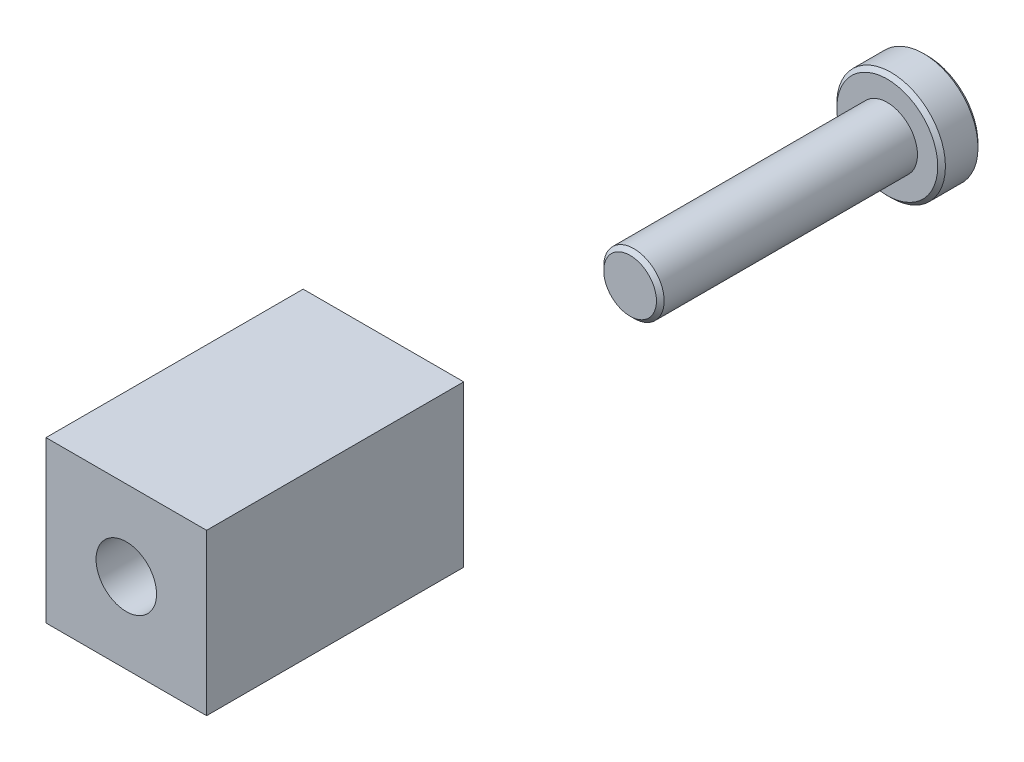
ISO-10303-21;
HEADER;
FILE_DESCRIPTION(('STEP AP214'),'2;1');
FILE_NAME('part.step','',(''),(''),'','','');
FILE_SCHEMA(('AUTOMOTIVE_DESIGN { 1 0 10303 214 1 1 1 1 }'));
ENDSEC;
DATA;
#1=APPLICATION_CONTEXT('core data for automotive mechanical design processes');
#2=APPLICATION_PROTOCOL_DEFINITION('international standard','automotive_design',2000,#1);
#3=PRODUCT_CONTEXT('',#1,'mechanical');
#4=PRODUCT('Part','Part','',(#3));
#5=PRODUCT_RELATED_PRODUCT_CATEGORY('part','',(#4));
#6=PRODUCT_DEFINITION_FORMATION('','',#4);
#7=PRODUCT_DEFINITION_CONTEXT('part definition',#1,'design');
#8=PRODUCT_DEFINITION('design','',#6,#7);
#9=PRODUCT_DEFINITION_SHAPE('','',#8);
#10=(LENGTH_UNIT() NAMED_UNIT(*) SI_UNIT(.MILLI.,.METRE.));
#11=(NAMED_UNIT(*) PLANE_ANGLE_UNIT() SI_UNIT($,.RADIAN.));
#12=(NAMED_UNIT(*) SI_UNIT($,.STERADIAN.) SOLID_ANGLE_UNIT());
#13=UNCERTAINTY_MEASURE_WITH_UNIT(LENGTH_MEASURE(1.E-05),#10,'distance_accuracy_value','');
#14=(GEOMETRIC_REPRESENTATION_CONTEXT(3) GLOBAL_UNCERTAINTY_ASSIGNED_CONTEXT((#13)) GLOBAL_UNIT_ASSIGNED_CONTEXT((#10,
#11,#12)) REPRESENTATION_CONTEXT('',''));
#15=CARTESIAN_POINT('',(0.,0.,0.));
#16=DIRECTION('',(0.,0.,1.));
#17=DIRECTION('',(1.,0.,0.));
#18=AXIS2_PLACEMENT_3D('',#15,#16,#17);
#19=CARTESIAN_POINT('',(-15.8613491960392,15.8613491960392,158.283276511442));
#20=DIRECTION('',(1.,0.,0.));
#21=DIRECTION('',(0.,1.,0.));
#22=AXIS2_PLACEMENT_3D('',#19,#20,#21);
#23=PLANE('',#22);
#24=DIRECTION('',(0.,-1.,0.));
#25=VECTOR('',#24,1.);
#26=CARTESIAN_POINT('',(-15.8613491960392,15.8613491960392,107.483276511442));
#27=LINE('',#26,#25);
#28=CARTESIAN_POINT('',(-15.8613491960392,15.8613491960392,107.483276511442));
#29=VERTEX_POINT('',#28);
#30=CARTESIAN_POINT('',(-15.8613491960392,-15.8613491960392,107.483276511442));
#31=VERTEX_POINT('',#30);
#32=EDGE_CURVE('E108',#29,#31,#27,.T.);
#33=ORIENTED_EDGE('',*,*,#32,.T.);
#34=DIRECTION('',(0.,0.,-1.));
#35=VECTOR('',#34,1.);
#36=CARTESIAN_POINT('',(-15.8613491960392,-15.8613491960392,158.283276511442));
#37=LINE('',#36,#35);
#38=CARTESIAN_POINT('',(-15.8613491960392,-15.8613491960392,158.283276511442));
#39=VERTEX_POINT('',#38);
#40=EDGE_CURVE('E12',#39,#31,#37,.T.);
#41=ORIENTED_EDGE('',*,*,#40,.F.);
#42=DIRECTION('',(0.,-1.,0.));
#43=VECTOR('',#42,1.);
#44=CARTESIAN_POINT('',(-15.8613491960392,15.8613491960392,158.283276511442));
#45=LINE('',#44,#43);
#46=CARTESIAN_POINT('',(-15.8613491960392,15.8613491960392,158.283276511442));
#47=VERTEX_POINT('',#46);
#48=EDGE_CURVE('E96',#47,#39,#45,.T.);
#49=ORIENTED_EDGE('',*,*,#48,.F.);
#50=DIRECTION('',(0.,0.,-1.));
#51=VECTOR('',#50,1.);
#52=CARTESIAN_POINT('',(-15.8613491960392,15.8613491960392,158.283276511442));
#53=LINE('',#52,#51);
#54=EDGE_CURVE('E104',#47,#29,#53,.T.);
#55=ORIENTED_EDGE('',*,*,#54,.T.);
#56=EDGE_LOOP('',(#33,#41,#49,#55));
#57=FACE_BOUND('',#56,.T.);
#58=ADVANCED_FACE('F45',(#57),#23,.F.);
#59=CARTESIAN_POINT('',(-15.8613491960392,-15.8613491960392,158.283276511442));
#60=DIRECTION('',(0.,1.,0.));
#61=DIRECTION('',(0.,0.,1.));
#62=AXIS2_PLACEMENT_3D('',#59,#60,#61);
#63=PLANE('',#62);
#64=DIRECTION('',(1.,0.,0.));
#65=VECTOR('',#64,1.);
#66=CARTESIAN_POINT('',(-15.8613491960392,-15.8613491960392,107.483276511442));
#67=LINE('',#66,#65);
#68=CARTESIAN_POINT('',(15.8613491960392,-15.8613491960392,107.483276511442));
#69=VERTEX_POINT('',#68);
#70=EDGE_CURVE('E100',#31,#69,#67,.T.);
#71=ORIENTED_EDGE('',*,*,#70,.T.);
#72=DIRECTION('',(0.,0.,-1.));
#73=VECTOR('',#72,1.);
#74=CARTESIAN_POINT('',(15.8613491960392,-15.8613491960392,158.283276511442));
#75=LINE('',#74,#73);
#76=CARTESIAN_POINT('',(15.8613491960392,-15.8613491960392,158.283276511442));
#77=VERTEX_POINT('',#76);
#78=EDGE_CURVE('E53',#77,#69,#75,.T.);
#79=ORIENTED_EDGE('',*,*,#78,.F.);
#80=DIRECTION('',(1.,0.,0.));
#81=VECTOR('',#80,1.);
#82=CARTESIAN_POINT('',(-15.8613491960392,-15.8613491960392,158.283276511442));
#83=LINE('',#82,#81);
#84=EDGE_CURVE('E91',#39,#77,#83,.T.);
#85=ORIENTED_EDGE('',*,*,#84,.F.);
#86=ORIENTED_EDGE('',*,*,#40,.T.);
#87=EDGE_LOOP('',(#71,#79,#85,#86));
#88=FACE_BOUND('',#87,.T.);
#89=ADVANCED_FACE('F99',(#88),#63,.F.);
#90=CARTESIAN_POINT('',(15.8613491960392,15.8613491960392,158.283276511442));
#91=DIRECTION('',(-1.,0.,0.));
#92=DIRECTION('',(0.,-1.,0.));
#93=AXIS2_PLACEMENT_3D('',#90,#91,#92);
#94=PLANE('',#93);
#95=DIRECTION('',(0.,1.,0.));
#96=VECTOR('',#95,1.);
#97=CARTESIAN_POINT('',(15.8613491960392,15.8613491960392,107.483276511442));
#98=LINE('',#97,#96);
#99=CARTESIAN_POINT('',(15.8613491960392,15.8613491960392,107.483276511442));
#100=VERTEX_POINT('',#99);
#101=EDGE_CURVE('E78',#69,#100,#98,.T.);
#102=ORIENTED_EDGE('',*,*,#101,.T.);
#103=DIRECTION('',(0.,0.,-1.));
#104=VECTOR('',#103,1.);
#105=CARTESIAN_POINT('',(15.8613491960392,15.8613491960392,158.283276511442));
#106=LINE('',#105,#104);
#107=CARTESIAN_POINT('',(15.8613491960392,15.8613491960392,158.283276511442));
#108=VERTEX_POINT('',#107);
#109=EDGE_CURVE('E101',#108,#100,#106,.T.);
#110=ORIENTED_EDGE('',*,*,#109,.F.);
#111=DIRECTION('',(0.,1.,0.));
#112=VECTOR('',#111,1.);
#113=CARTESIAN_POINT('',(15.8613491960392,15.8613491960392,158.283276511442));
#114=LINE('',#113,#112);
#115=EDGE_CURVE('E94',#77,#108,#114,.T.);
#116=ORIENTED_EDGE('',*,*,#115,.F.);
#117=ORIENTED_EDGE('',*,*,#78,.T.);
#118=EDGE_LOOP('',(#102,#110,#116,#117));
#119=FACE_BOUND('',#118,.T.);
#120=ADVANCED_FACE('F102',(#119),#94,.F.);
#121=CARTESIAN_POINT('',(-15.8613491960392,15.8613491960392,158.283276511442));
#122=DIRECTION('',(0.,-1.,0.));
#123=DIRECTION('',(0.,0.,-1.));
#124=AXIS2_PLACEMENT_3D('',#121,#122,#123);
#125=PLANE('',#124);
#126=DIRECTION('',(-1.,0.,0.));
#127=VECTOR('',#126,1.);
#128=CARTESIAN_POINT('',(-15.8613491960392,15.8613491960392,107.483276511442));
#129=LINE('',#128,#127);
#130=EDGE_CURVE('E84',#100,#29,#129,.T.);
#131=ORIENTED_EDGE('',*,*,#130,.T.);
#132=ORIENTED_EDGE('',*,*,#54,.F.);
#133=DIRECTION('',(-1.,0.,0.));
#134=VECTOR('',#133,1.);
#135=CARTESIAN_POINT('',(-15.8613491960392,15.8613491960392,158.283276511442));
#136=LINE('',#135,#134);
#137=EDGE_CURVE('E61',#108,#47,#136,.T.);
#138=ORIENTED_EDGE('',*,*,#137,.F.);
#139=ORIENTED_EDGE('',*,*,#109,.T.);
#140=EDGE_LOOP('',(#131,#132,#138,#139));
#141=FACE_BOUND('',#140,.T.);
#142=ADVANCED_FACE('F116',(#141),#125,.F.);
#143=CARTESIAN_POINT('',(0.,0.,158.283276511442));
#144=DIRECTION('',(0.,0.,1.));
#145=DIRECTION('',(1.,0.,0.));
#146=AXIS2_PLACEMENT_3D('',#143,#144,#145);
#147=PLANE('',#146);
#148=CARTESIAN_POINT('',(0.,0.,158.283276511442));
#149=DIRECTION('',(0.,0.,-1.));
#150=DIRECTION('',(-1.,0.,0.));
#151=AXIS2_PLACEMENT_3D('',#148,#149,#150);
#152=CIRCLE('',#151,5.97535);
#153=CARTESIAN_POINT('',(-5.97535,0.,158.283276511442));
#154=VERTEX_POINT('',#153);
#155=EDGE_CURVE('E111',#154,#154,#152,.T.);
#156=ORIENTED_EDGE('',*,*,#155,.T.);
#157=EDGE_LOOP('',(#156));
#158=FACE_BOUND('',#157,.T.);
#159=ORIENTED_EDGE('',*,*,#48,.T.);
#160=ORIENTED_EDGE('',*,*,#84,.T.);
#161=ORIENTED_EDGE('',*,*,#115,.T.);
#162=ORIENTED_EDGE('',*,*,#137,.T.);
#163=EDGE_LOOP('',(#159,#160,#161,#162));
#164=FACE_BOUND('',#163,.T.);
#165=ADVANCED_FACE('F92',(#158,#164),#147,.T.);
#166=CARTESIAN_POINT('',(0.,0.,107.483276511442));
#167=DIRECTION('',(0.,0.,1.));
#168=DIRECTION('',(1.,0.,0.));
#169=AXIS2_PLACEMENT_3D('',#166,#167,#168);
#170=PLANE('',#169);
#171=CARTESIAN_POINT('',(0.,0.,107.483276511442));
#172=DIRECTION('',(0.,0.,-1.));
#173=DIRECTION('',(-1.,0.,0.));
#174=AXIS2_PLACEMENT_3D('',#171,#172,#173);
#175=CIRCLE('',#174,5.97535);
#176=CARTESIAN_POINT('',(-5.97535,0.,107.483276511442));
#177=VERTEX_POINT('',#176);
#178=EDGE_CURVE('E122',#177,#177,#175,.T.);
#179=ORIENTED_EDGE('',*,*,#178,.F.);
#180=EDGE_LOOP('',(#179));
#181=FACE_BOUND('',#180,.T.);
#182=ORIENTED_EDGE('',*,*,#32,.F.);
#183=ORIENTED_EDGE('',*,*,#130,.F.);
#184=ORIENTED_EDGE('',*,*,#101,.F.);
#185=ORIENTED_EDGE('',*,*,#70,.F.);
#186=EDGE_LOOP('',(#182,#183,#184,#185));
#187=FACE_BOUND('',#186,.T.);
#188=ADVANCED_FACE('F119',(#181,#187),#170,.F.);
#189=CARTESIAN_POINT('',(0.,0.,158.283276511442));
#190=DIRECTION('',(0.,0.,-1.));
#191=DIRECTION('',(-1.,0.,0.));
#192=AXIS2_PLACEMENT_3D('',#189,#190,#191);
#193=CYLINDRICAL_SURFACE('',#192,5.97535);
#194=ORIENTED_EDGE('',*,*,#155,.F.);
#195=EDGE_LOOP('',(#194));
#196=FACE_BOUND('',#195,.T.);
#197=ORIENTED_EDGE('',*,*,#178,.T.);
#198=EDGE_LOOP('',(#197));
#199=FACE_BOUND('',#198,.T.);
#200=ADVANCED_FACE('F129',(#196,#199),#193,.F.);
#201=CLOSED_SHELL('',(#58,#89,#120,#142,#165,#188,#200));
#202=MANIFOLD_SOLID_BREP('B2',#201);
#203=CARTESIAN_POINT('',(0.,0.,7.95866666666667));
#204=DIRECTION('',(0.,0.,1.));
#205=DIRECTION('',(1.,0.,0.));
#206=AXIS2_PLACEMENT_3D('',#203,#204,#205);
#207=PLANE('',#206);
#208=CARTESIAN_POINT('',(0.,0.,7.95866666666667));
#209=DIRECTION('',(0.,0.,1.));
#210=DIRECTION('',(1.,0.,0.));
#211=AXIS2_PLACEMENT_3D('',#208,#209,#210);
#212=CIRCLE('',#211,9.96950000000001);
#213=CARTESIAN_POINT('',(9.96950000000001,0.,7.95866666666667));
#214=VERTEX_POINT('',#213);
#215=EDGE_CURVE('E201',#214,#214,#212,.T.);
#216=ORIENTED_EDGE('',*,*,#215,.T.);
#217=EDGE_LOOP('',(#216));
#218=FACE_BOUND('',#217,.T.);
#219=CARTESIAN_POINT('',(0.,0.,7.95866666666667));
#220=DIRECTION('',(0.,0.,1.));
#221=DIRECTION('',(1.,0.,0.));
#222=AXIS2_PLACEMENT_3D('',#219,#220,#221);
#223=CIRCLE('',#222,5.969);
#224=CARTESIAN_POINT('',(5.969,0.,7.95866666666667));
#225=VERTEX_POINT('',#224);
#226=EDGE_CURVE('E216',#225,#225,#223,.T.);
#227=ORIENTED_EDGE('',*,*,#226,.F.);
#228=EDGE_LOOP('',(#227));
#229=FACE_BOUND('',#228,.T.);
#230=ADVANCED_FACE('F190',(#218,#229),#207,.T.);
#231=CARTESIAN_POINT('',(0.,0.,7.95866666666667));
#232=DIRECTION('',(0.,0.,-1.));
#233=DIRECTION('',(-1.,0.,0.));
#234=AXIS2_PLACEMENT_3D('',#231,#232,#233);
#235=CYLINDRICAL_SURFACE('',#234,10.7315);
#236=CARTESIAN_POINT('',(0.,0.,0.761999999999992));
#237=DIRECTION('',(0.,0.,1.));
#238=DIRECTION('',(1.,0.,0.));
#239=AXIS2_PLACEMENT_3D('',#236,#237,#238);
#240=CIRCLE('',#239,10.7315);
#241=CARTESIAN_POINT('',(10.7315,0.,0.761999999999992));
#242=VERTEX_POINT('',#241);
#243=EDGE_CURVE('E210',#242,#242,#240,.T.);
#244=ORIENTED_EDGE('',*,*,#243,.T.);
#245=EDGE_LOOP('',(#244));
#246=FACE_BOUND('',#245,.T.);
#247=CARTESIAN_POINT('',(0.,0.,7.19666666666667));
#248=DIRECTION('',(0.,0.,1.));
#249=DIRECTION('',(1.,0.,0.));
#250=AXIS2_PLACEMENT_3D('',#247,#248,#249);
#251=CIRCLE('',#250,10.7315);
#252=CARTESIAN_POINT('',(10.7315,0.,7.19666666666667));
#253=VERTEX_POINT('',#252);
#254=EDGE_CURVE('E213',#253,#253,#251,.F.);
#255=ORIENTED_EDGE('',*,*,#254,.T.);
#256=EDGE_LOOP('',(#255));
#257=FACE_BOUND('',#256,.T.);
#258=ADVANCED_FACE('F223',(#246,#257),#235,.T.);
#259=CARTESIAN_POINT('',(0.,0.,0.));
#260=DIRECTION('',(0.,0.,1.));
#261=DIRECTION('',(1.,0.,0.));
#262=AXIS2_PLACEMENT_3D('',#259,#260,#261);
#263=PLANE('',#262);
#264=CARTESIAN_POINT('',(0.,0.,0.));
#265=DIRECTION('',(0.,0.,1.));
#266=DIRECTION('',(1.,0.,0.));
#267=AXIS2_PLACEMENT_3D('',#264,#265,#266);
#268=CIRCLE('',#267,9.9695);
#269=CARTESIAN_POINT('',(9.9695,0.,0.));
#270=VERTEX_POINT('',#269);
#271=EDGE_CURVE('E205',#270,#270,#268,.F.);
#272=ORIENTED_EDGE('',*,*,#271,.T.);
#273=EDGE_LOOP('',(#272));
#274=FACE_BOUND('',#273,.T.);
#275=ADVANCED_FACE('F229',(#274),#263,.F.);
#276=CARTESIAN_POINT('',(0.,0.,58.7586666666667));
#277=DIRECTION('',(0.,0.,-1.));
#278=DIRECTION('',(-1.,0.,0.));
#279=AXIS2_PLACEMENT_3D('',#276,#277,#278);
#280=CYLINDRICAL_SURFACE('',#279,5.969);
#281=CARTESIAN_POINT('',(0.,0.,57.9966666666667));
#282=DIRECTION('',(0.,0.,1.));
#283=DIRECTION('',(1.,0.,0.));
#284=AXIS2_PLACEMENT_3D('',#281,#282,#283);
#285=CIRCLE('',#284,5.969);
#286=CARTESIAN_POINT('',(5.969,0.,57.9966666666667));
#287=VERTEX_POINT('',#286);
#288=EDGE_CURVE('E44',#287,#287,#285,.F.);
#289=ORIENTED_EDGE('',*,*,#288,.T.);
#290=EDGE_LOOP('',(#289));
#291=FACE_BOUND('',#290,.T.);
#292=ORIENTED_EDGE('',*,*,#226,.T.);
#293=EDGE_LOOP('',(#292));
#294=FACE_BOUND('',#293,.T.);
#295=ADVANCED_FACE('F220',(#291,#294),#280,.T.);
#296=CARTESIAN_POINT('',(0.,0.,58.7586666666667));
#297=DIRECTION('',(0.,0.,1.));
#298=DIRECTION('',(1.,0.,0.));
#299=AXIS2_PLACEMENT_3D('',#296,#297,#298);
#300=PLANE('',#299);
#301=CARTESIAN_POINT('',(0.,0.,58.7586666666667));
#302=DIRECTION('',(0.,0.,1.));
#303=DIRECTION('',(1.,0.,0.));
#304=AXIS2_PLACEMENT_3D('',#301,#302,#303);
#305=CIRCLE('',#304,5.20700000000001);
#306=CARTESIAN_POINT('',(5.20700000000001,0.,58.7586666666667));
#307=VERTEX_POINT('',#306);
#308=EDGE_CURVE('E197',#307,#307,#305,.T.);
#309=ORIENTED_EDGE('',*,*,#308,.T.);
#310=EDGE_LOOP('',(#309));
#311=FACE_BOUND('',#310,.T.);
#312=ADVANCED_FACE('F241',(#311),#300,.T.);
#313=CARTESIAN_POINT('',(0.,0.,0.761999999999992));
#314=DIRECTION('',(0.,0.,1.));
#315=DIRECTION('',(1.,0.,0.));
#316=AXIS2_PLACEMENT_3D('',#313,#314,#315);
#317=CONICAL_SURFACE('',#316,10.7315,0.785398163397454);
#318=ORIENTED_EDGE('',*,*,#271,.F.);
#319=EDGE_LOOP('',(#318));
#320=FACE_BOUND('',#319,.T.);
#321=ORIENTED_EDGE('',*,*,#243,.F.);
#322=EDGE_LOOP('',(#321));
#323=FACE_BOUND('',#322,.T.);
#324=ADVANCED_FACE('F238',(#320,#323),#317,.T.);
#325=CARTESIAN_POINT('',(0.,0.,7.95866666666667));
#326=DIRECTION('',(0.,0.,-1.));
#327=DIRECTION('',(-1.,0.,0.));
#328=AXIS2_PLACEMENT_3D('',#325,#326,#327);
#329=CONICAL_SURFACE('',#328,9.96950000000001,0.785398163397449);
#330=ORIENTED_EDGE('',*,*,#254,.F.);
#331=EDGE_LOOP('',(#330));
#332=FACE_BOUND('',#331,.T.);
#333=ORIENTED_EDGE('',*,*,#215,.F.);
#334=EDGE_LOOP('',(#333));
#335=FACE_BOUND('',#334,.T.);
#336=ADVANCED_FACE('F240',(#332,#335),#329,.T.);
#337=CARTESIAN_POINT('',(0.,0.,58.7586666666667));
#338=DIRECTION('',(0.,0.,-1.));
#339=DIRECTION('',(-1.,0.,0.));
#340=AXIS2_PLACEMENT_3D('',#337,#338,#339);
#341=CONICAL_SURFACE('',#340,5.20700000000001,0.785398163397447);
#342=ORIENTED_EDGE('',*,*,#288,.F.);
#343=EDGE_LOOP('',(#342));
#344=FACE_BOUND('',#343,.T.);
#345=ORIENTED_EDGE('',*,*,#308,.F.);
#346=EDGE_LOOP('',(#345));
#347=FACE_BOUND('',#346,.T.);
#348=ADVANCED_FACE('F192',(#344,#347),#341,.T.);
#349=CLOSED_SHELL('',(#230,#258,#275,#295,#312,#324,#336,#348));
#350=MANIFOLD_SOLID_BREP('B6',#349);
#351=ADVANCED_BREP_SHAPE_REPRESENTATION('',(#18,#202,#350),#14);
#352=SHAPE_DEFINITION_REPRESENTATION(#9,#351);
ENDSEC;
END-ISO-10303-21;
